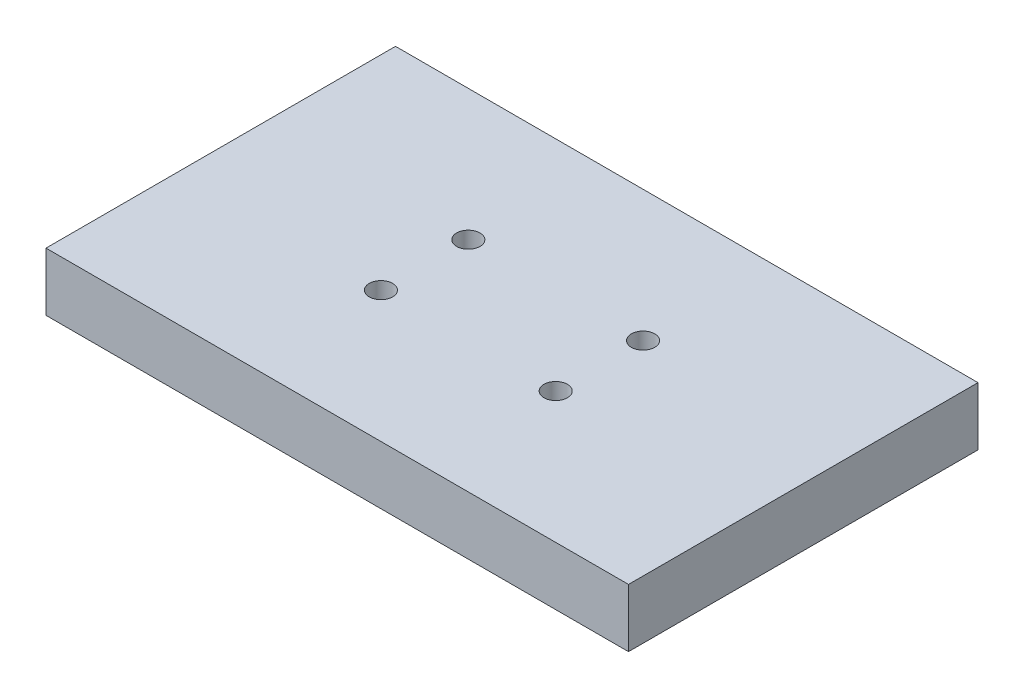
ISO-10303-21;
HEADER;
FILE_DESCRIPTION(('STEP AP214'),'2;1');
FILE_NAME('part.step','',(''),(''),'','','');
FILE_SCHEMA(('AUTOMOTIVE_DESIGN { 1 0 10303 214 1 1 1 1 }'));
ENDSEC;
DATA;
#1=APPLICATION_CONTEXT('core data for automotive mechanical design processes');
#2=APPLICATION_PROTOCOL_DEFINITION('international standard','automotive_design',2000,#1);
#3=PRODUCT_CONTEXT('',#1,'mechanical');
#4=PRODUCT('Part','Part','',(#3));
#5=PRODUCT_RELATED_PRODUCT_CATEGORY('part','',(#4));
#6=PRODUCT_DEFINITION_FORMATION('','',#4);
#7=PRODUCT_DEFINITION_CONTEXT('part definition',#1,'design');
#8=PRODUCT_DEFINITION('design','',#6,#7);
#9=PRODUCT_DEFINITION_SHAPE('','',#8);
#10=(LENGTH_UNIT() NAMED_UNIT(*) SI_UNIT(.MILLI.,.METRE.));
#11=(NAMED_UNIT(*) PLANE_ANGLE_UNIT() SI_UNIT($,.RADIAN.));
#12=(NAMED_UNIT(*) SI_UNIT($,.STERADIAN.) SOLID_ANGLE_UNIT());
#13=UNCERTAINTY_MEASURE_WITH_UNIT(LENGTH_MEASURE(1.E-05),#10,'distance_accuracy_value','');
#14=(GEOMETRIC_REPRESENTATION_CONTEXT(3) GLOBAL_UNCERTAINTY_ASSIGNED_CONTEXT((#13)) GLOBAL_UNIT_ASSIGNED_CONTEXT((#10,
#11,#12)) REPRESENTATION_CONTEXT('',''));
#15=CARTESIAN_POINT('',(0.,0.,0.));
#16=DIRECTION('',(0.,0.,1.));
#17=DIRECTION('',(1.,0.,0.));
#18=AXIS2_PLACEMENT_3D('',#15,#16,#17);
#19=CARTESIAN_POINT('',(0.,12.7,0.));
#20=DIRECTION('',(-1.,0.,0.));
#21=DIRECTION('',(0.,0.,1.));
#22=AXIS2_PLACEMENT_3D('',#19,#20,#21);
#23=PLANE('',#22);
#24=DIRECTION('',(0.,0.,-1.));
#25=VECTOR('',#24,1.);
#26=CARTESIAN_POINT('',(0.,0.,0.));
#27=LINE('',#26,#25);
#28=CARTESIAN_POINT('',(0.,0.,0.));
#29=VERTEX_POINT('',#28);
#30=CARTESIAN_POINT('',(0.,0.,-76.2));
#31=VERTEX_POINT('',#30);
#32=EDGE_CURVE('E96',#29,#31,#27,.T.);
#33=ORIENTED_EDGE('',*,*,#32,.T.);
#34=DIRECTION('',(0.,-1.,0.));
#35=VECTOR('',#34,1.);
#36=CARTESIAN_POINT('',(0.,12.7,-76.2));
#37=LINE('',#36,#35);
#38=CARTESIAN_POINT('',(0.,12.7,-76.2));
#39=VERTEX_POINT('',#38);
#40=EDGE_CURVE('E11',#39,#31,#37,.T.);
#41=ORIENTED_EDGE('',*,*,#40,.F.);
#42=DIRECTION('',(0.,0.,-1.));
#43=VECTOR('',#42,1.);
#44=CARTESIAN_POINT('',(0.,12.7,0.));
#45=LINE('',#44,#43);
#46=CARTESIAN_POINT('',(0.,12.7,0.));
#47=VERTEX_POINT('',#46);
#48=EDGE_CURVE('E84',#47,#39,#45,.T.);
#49=ORIENTED_EDGE('',*,*,#48,.F.);
#50=DIRECTION('',(0.,-1.,0.));
#51=VECTOR('',#50,1.);
#52=CARTESIAN_POINT('',(0.,12.7,0.));
#53=LINE('',#52,#51);
#54=EDGE_CURVE('E92',#47,#29,#53,.T.);
#55=ORIENTED_EDGE('',*,*,#54,.T.);
#56=EDGE_LOOP('',(#33,#41,#49,#55));
#57=FACE_BOUND('',#56,.T.);
#58=ADVANCED_FACE('F33',(#57),#23,.F.);
#59=CARTESIAN_POINT('',(0.,12.7,-76.2));
#60=DIRECTION('',(0.,0.,1.));
#61=DIRECTION('',(1.,0.,0.));
#62=AXIS2_PLACEMENT_3D('',#59,#60,#61);
#63=PLANE('',#62);
#64=DIRECTION('',(-1.,0.,0.));
#65=VECTOR('',#64,1.);
#66=CARTESIAN_POINT('',(0.,0.,-76.2));
#67=LINE('',#66,#65);
#68=CARTESIAN_POINT('',(-127.,0.,-76.2));
#69=VERTEX_POINT('',#68);
#70=EDGE_CURVE('E88',#31,#69,#67,.T.);
#71=ORIENTED_EDGE('',*,*,#70,.T.);
#72=DIRECTION('',(0.,-1.,0.));
#73=VECTOR('',#72,1.);
#74=CARTESIAN_POINT('',(-127.,12.7,-76.2));
#75=LINE('',#74,#73);
#76=CARTESIAN_POINT('',(-127.,12.7,-76.2));
#77=VERTEX_POINT('',#76);
#78=EDGE_CURVE('E41',#77,#69,#75,.T.);
#79=ORIENTED_EDGE('',*,*,#78,.F.);
#80=DIRECTION('',(-1.,0.,0.));
#81=VECTOR('',#80,1.);
#82=CARTESIAN_POINT('',(0.,12.7,-76.2));
#83=LINE('',#82,#81);
#84=EDGE_CURVE('E79',#39,#77,#83,.T.);
#85=ORIENTED_EDGE('',*,*,#84,.F.);
#86=ORIENTED_EDGE('',*,*,#40,.T.);
#87=EDGE_LOOP('',(#71,#79,#85,#86));
#88=FACE_BOUND('',#87,.T.);
#89=ADVANCED_FACE('F87',(#88),#63,.F.);
#90=CARTESIAN_POINT('',(-127.,12.7,0.));
#91=DIRECTION('',(1.,0.,0.));
#92=DIRECTION('',(0.,0.,-1.));
#93=AXIS2_PLACEMENT_3D('',#90,#91,#92);
#94=PLANE('',#93);
#95=DIRECTION('',(0.,0.,1.));
#96=VECTOR('',#95,1.);
#97=CARTESIAN_POINT('',(-127.,0.,0.));
#98=LINE('',#97,#96);
#99=CARTESIAN_POINT('',(-127.,0.,0.));
#100=VERTEX_POINT('',#99);
#101=EDGE_CURVE('E66',#69,#100,#98,.T.);
#102=ORIENTED_EDGE('',*,*,#101,.T.);
#103=DIRECTION('',(0.,-1.,0.));
#104=VECTOR('',#103,1.);
#105=CARTESIAN_POINT('',(-127.,12.7,0.));
#106=LINE('',#105,#104);
#107=CARTESIAN_POINT('',(-127.,12.7,0.));
#108=VERTEX_POINT('',#107);
#109=EDGE_CURVE('E89',#108,#100,#106,.T.);
#110=ORIENTED_EDGE('',*,*,#109,.F.);
#111=DIRECTION('',(0.,0.,1.));
#112=VECTOR('',#111,1.);
#113=CARTESIAN_POINT('',(-127.,12.7,0.));
#114=LINE('',#113,#112);
#115=EDGE_CURVE('E82',#77,#108,#114,.T.);
#116=ORIENTED_EDGE('',*,*,#115,.F.);
#117=ORIENTED_EDGE('',*,*,#78,.T.);
#118=EDGE_LOOP('',(#102,#110,#116,#117));
#119=FACE_BOUND('',#118,.T.);
#120=ADVANCED_FACE('F90',(#119),#94,.F.);
#121=CARTESIAN_POINT('',(0.,12.7,0.));
#122=DIRECTION('',(0.,0.,-1.));
#123=DIRECTION('',(-1.,0.,0.));
#124=AXIS2_PLACEMENT_3D('',#121,#122,#123);
#125=PLANE('',#124);
#126=DIRECTION('',(1.,0.,0.));
#127=VECTOR('',#126,1.);
#128=CARTESIAN_POINT('',(0.,0.,0.));
#129=LINE('',#128,#127);
#130=EDGE_CURVE('E72',#100,#29,#129,.T.);
#131=ORIENTED_EDGE('',*,*,#130,.T.);
#132=ORIENTED_EDGE('',*,*,#54,.F.);
#133=DIRECTION('',(1.,0.,0.));
#134=VECTOR('',#133,1.);
#135=CARTESIAN_POINT('',(0.,12.7,0.));
#136=LINE('',#135,#134);
#137=EDGE_CURVE('E49',#108,#47,#136,.T.);
#138=ORIENTED_EDGE('',*,*,#137,.F.);
#139=ORIENTED_EDGE('',*,*,#109,.T.);
#140=EDGE_LOOP('',(#131,#132,#138,#139));
#141=FACE_BOUND('',#140,.T.);
#142=ADVANCED_FACE('F104',(#141),#125,.F.);
#143=CARTESIAN_POINT('',(0.,12.7,0.));
#144=DIRECTION('',(0.,1.,0.));
#145=DIRECTION('',(0.,0.,1.));
#146=AXIS2_PLACEMENT_3D('',#143,#144,#145);
#147=PLANE('',#146);
#148=CARTESIAN_POINT('',(-82.55,12.7,-47.625));
#149=DIRECTION('',(0.,1.,0.));
#150=DIRECTION('',(0.,0.,1.));
#151=AXIS2_PLACEMENT_3D('',#148,#149,#150);
#152=CIRCLE('',#151,2.55269999999999);
#153=CARTESIAN_POINT('',(-82.55,12.7,-45.0723));
#154=VERTEX_POINT('',#153);
#155=EDGE_CURVE('E130',#154,#154,#152,.T.);
#156=ORIENTED_EDGE('',*,*,#155,.F.);
#157=EDGE_LOOP('',(#156));
#158=FACE_BOUND('',#157,.T.);
#159=CARTESIAN_POINT('',(-82.55,12.7,-28.575));
#160=DIRECTION('',(0.,1.,0.));
#161=DIRECTION('',(0.,0.,1.));
#162=AXIS2_PLACEMENT_3D('',#159,#160,#161);
#163=CIRCLE('',#162,2.55269999999999);
#164=CARTESIAN_POINT('',(-82.55,12.7,-26.0223));
#165=VERTEX_POINT('',#164);
#166=EDGE_CURVE('E124',#165,#165,#163,.T.);
#167=ORIENTED_EDGE('',*,*,#166,.F.);
#168=EDGE_LOOP('',(#167));
#169=FACE_BOUND('',#168,.T.);
#170=CARTESIAN_POINT('',(-44.45,12.7,-28.575));
#171=DIRECTION('',(0.,1.,0.));
#172=DIRECTION('',(0.,0.,1.));
#173=AXIS2_PLACEMENT_3D('',#170,#171,#172);
#174=CIRCLE('',#173,2.55269999999998);
#175=CARTESIAN_POINT('',(-44.45,12.7,-26.0223));
#176=VERTEX_POINT('',#175);
#177=EDGE_CURVE('E118',#176,#176,#174,.T.);
#178=ORIENTED_EDGE('',*,*,#177,.F.);
#179=EDGE_LOOP('',(#178));
#180=FACE_BOUND('',#179,.T.);
#181=CARTESIAN_POINT('',(-44.45,12.7,-47.625));
#182=DIRECTION('',(0.,1.,0.));
#183=DIRECTION('',(0.,0.,1.));
#184=AXIS2_PLACEMENT_3D('',#181,#182,#183);
#185=CIRCLE('',#184,2.55269999999998);
#186=CARTESIAN_POINT('',(-44.45,12.7,-45.0723));
#187=VERTEX_POINT('',#186);
#188=EDGE_CURVE('E112',#187,#187,#185,.T.);
#189=ORIENTED_EDGE('',*,*,#188,.F.);
#190=EDGE_LOOP('',(#189));
#191=FACE_BOUND('',#190,.T.);
#192=ORIENTED_EDGE('',*,*,#48,.T.);
#193=ORIENTED_EDGE('',*,*,#84,.T.);
#194=ORIENTED_EDGE('',*,*,#115,.T.);
#195=ORIENTED_EDGE('',*,*,#137,.T.);
#196=EDGE_LOOP('',(#192,#193,#194,#195));
#197=FACE_BOUND('',#196,.T.);
#198=ADVANCED_FACE('F80',(#158,#169,#180,#191,#197),#147,.T.);
#199=CARTESIAN_POINT('',(0.,0.,0.));
#200=DIRECTION('',(0.,1.,0.));
#201=DIRECTION('',(0.,0.,1.));
#202=AXIS2_PLACEMENT_3D('',#199,#200,#201);
#203=PLANE('',#202);
#204=CARTESIAN_POINT('',(-82.55,0.,-47.625));
#205=DIRECTION('',(0.,1.,0.));
#206=DIRECTION('',(0.,0.,1.));
#207=AXIS2_PLACEMENT_3D('',#204,#205,#206);
#208=CIRCLE('',#207,2.55269999999999);
#209=CARTESIAN_POINT('',(-82.55,0.,-45.0723));
#210=VERTEX_POINT('',#209);
#211=EDGE_CURVE('E127',#210,#210,#208,.T.);
#212=ORIENTED_EDGE('',*,*,#211,.T.);
#213=EDGE_LOOP('',(#212));
#214=FACE_BOUND('',#213,.T.);
#215=CARTESIAN_POINT('',(-82.55,0.,-28.575));
#216=DIRECTION('',(0.,1.,0.));
#217=DIRECTION('',(0.,0.,1.));
#218=AXIS2_PLACEMENT_3D('',#215,#216,#217);
#219=CIRCLE('',#218,2.55269999999999);
#220=CARTESIAN_POINT('',(-82.55,0.,-26.0223));
#221=VERTEX_POINT('',#220);
#222=EDGE_CURVE('E121',#221,#221,#219,.T.);
#223=ORIENTED_EDGE('',*,*,#222,.T.);
#224=EDGE_LOOP('',(#223));
#225=FACE_BOUND('',#224,.T.);
#226=CARTESIAN_POINT('',(-44.45,0.,-28.575));
#227=DIRECTION('',(0.,1.,0.));
#228=DIRECTION('',(0.,0.,1.));
#229=AXIS2_PLACEMENT_3D('',#226,#227,#228);
#230=CIRCLE('',#229,2.55269999999999);
#231=CARTESIAN_POINT('',(-44.45,0.,-26.0223));
#232=VERTEX_POINT('',#231);
#233=EDGE_CURVE('E115',#232,#232,#230,.T.);
#234=ORIENTED_EDGE('',*,*,#233,.T.);
#235=EDGE_LOOP('',(#234));
#236=FACE_BOUND('',#235,.T.);
#237=CARTESIAN_POINT('',(-44.45,0.,-47.625));
#238=DIRECTION('',(0.,1.,0.));
#239=DIRECTION('',(0.,0.,1.));
#240=AXIS2_PLACEMENT_3D('',#237,#238,#239);
#241=CIRCLE('',#240,2.55269999999999);
#242=CARTESIAN_POINT('',(-44.45,0.,-45.0723));
#243=VERTEX_POINT('',#242);
#244=EDGE_CURVE('E99',#243,#243,#241,.T.);
#245=ORIENTED_EDGE('',*,*,#244,.T.);
#246=EDGE_LOOP('',(#245));
#247=FACE_BOUND('',#246,.T.);
#248=ORIENTED_EDGE('',*,*,#32,.F.);
#249=ORIENTED_EDGE('',*,*,#130,.F.);
#250=ORIENTED_EDGE('',*,*,#101,.F.);
#251=ORIENTED_EDGE('',*,*,#70,.F.);
#252=EDGE_LOOP('',(#248,#249,#250,#251));
#253=FACE_BOUND('',#252,.T.);
#254=ADVANCED_FACE('F107',(#214,#225,#236,#247,#253),#203,.F.);
#255=CARTESIAN_POINT('',(-44.45,12.7,-47.625));
#256=DIRECTION('',(0.,1.,0.));
#257=DIRECTION('',(0.,0.,1.));
#258=AXIS2_PLACEMENT_3D('',#255,#256,#257);
#259=CYLINDRICAL_SURFACE('',#258,2.55269999999999);
#260=ORIENTED_EDGE('',*,*,#244,.F.);
#261=EDGE_LOOP('',(#260));
#262=FACE_BOUND('',#261,.T.);
#263=ORIENTED_EDGE('',*,*,#188,.T.);
#264=EDGE_LOOP('',(#263));
#265=FACE_BOUND('',#264,.T.);
#266=ADVANCED_FACE('F145',(#262,#265),#259,.F.);
#267=CARTESIAN_POINT('',(-44.45,12.7,-28.575));
#268=DIRECTION('',(0.,1.,0.));
#269=DIRECTION('',(0.,0.,1.));
#270=AXIS2_PLACEMENT_3D('',#267,#268,#269);
#271=CYLINDRICAL_SURFACE('',#270,2.55269999999999);
#272=ORIENTED_EDGE('',*,*,#233,.F.);
#273=EDGE_LOOP('',(#272));
#274=FACE_BOUND('',#273,.T.);
#275=ORIENTED_EDGE('',*,*,#177,.T.);
#276=EDGE_LOOP('',(#275));
#277=FACE_BOUND('',#276,.T.);
#278=ADVANCED_FACE('F147',(#274,#277),#271,.F.);
#279=CARTESIAN_POINT('',(-82.55,12.7,-28.575));
#280=DIRECTION('',(0.,1.,0.));
#281=DIRECTION('',(0.,0.,1.));
#282=AXIS2_PLACEMENT_3D('',#279,#280,#281);
#283=CYLINDRICAL_SURFACE('',#282,2.55269999999999);
#284=ORIENTED_EDGE('',*,*,#222,.F.);
#285=EDGE_LOOP('',(#284));
#286=FACE_BOUND('',#285,.T.);
#287=ORIENTED_EDGE('',*,*,#166,.T.);
#288=EDGE_LOOP('',(#287));
#289=FACE_BOUND('',#288,.T.);
#290=ADVANCED_FACE('F154',(#286,#289),#283,.F.);
#291=CARTESIAN_POINT('',(-82.55,12.7,-47.625));
#292=DIRECTION('',(0.,1.,0.));
#293=DIRECTION('',(0.,0.,1.));
#294=AXIS2_PLACEMENT_3D('',#291,#292,#293);
#295=CYLINDRICAL_SURFACE('',#294,2.55269999999999);
#296=ORIENTED_EDGE('',*,*,#211,.F.);
#297=EDGE_LOOP('',(#296));
#298=FACE_BOUND('',#297,.T.);
#299=ORIENTED_EDGE('',*,*,#155,.T.);
#300=EDGE_LOOP('',(#299));
#301=FACE_BOUND('',#300,.T.);
#302=ADVANCED_FACE('F134',(#298,#301),#295,.F.);
#303=CLOSED_SHELL('',(#58,#89,#120,#142,#198,#254,#266,#278,#290,#302));
#304=MANIFOLD_SOLID_BREP('B2',#303);
#305=ADVANCED_BREP_SHAPE_REPRESENTATION('',(#18,#304),#14);
#306=SHAPE_DEFINITION_REPRESENTATION(#9,#305);
ENDSEC;
END-ISO-10303-21;
